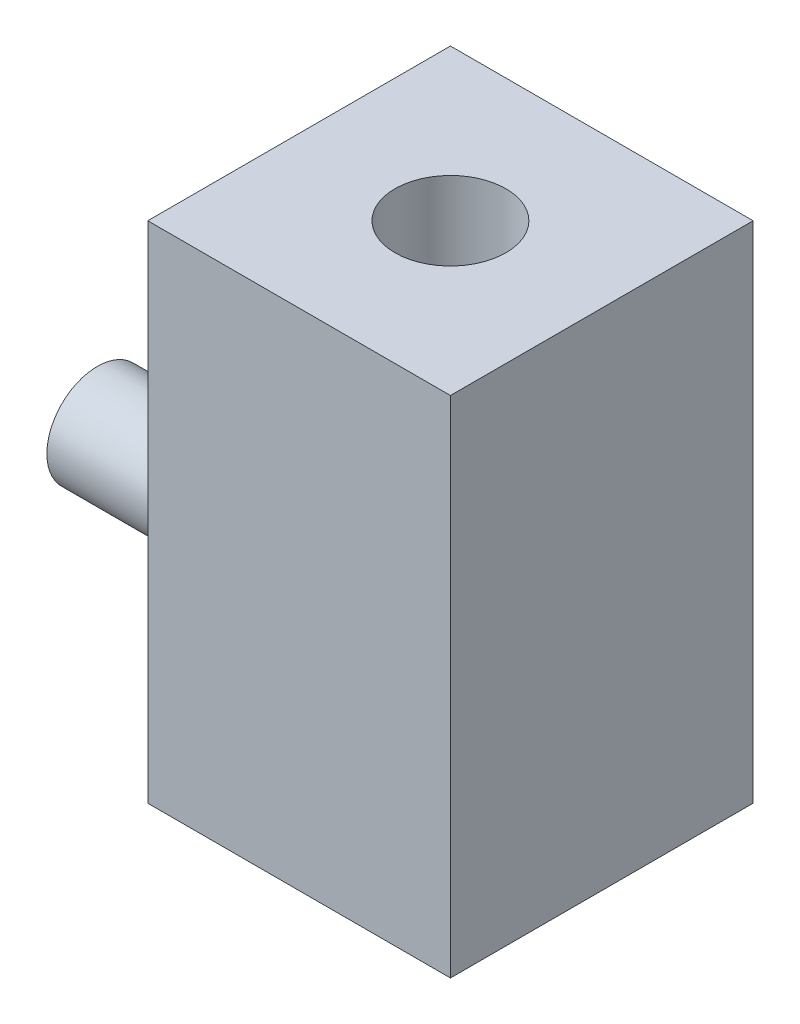
ISO-10303-21;
HEADER;
FILE_DESCRIPTION(('STEP AP214'),'2;1');
FILE_NAME('part.step','',(''),(''),'','','');
FILE_SCHEMA(('AUTOMOTIVE_DESIGN { 1 0 10303 214 1 1 1 1 }'));
ENDSEC;
DATA;
#1=APPLICATION_CONTEXT('core data for automotive mechanical design processes');
#2=APPLICATION_PROTOCOL_DEFINITION('international standard','automotive_design',2000,#1);
#3=PRODUCT_CONTEXT('',#1,'mechanical');
#4=PRODUCT('Part','Part','',(#3));
#5=PRODUCT_RELATED_PRODUCT_CATEGORY('part','',(#4));
#6=PRODUCT_DEFINITION_FORMATION('','',#4);
#7=PRODUCT_DEFINITION_CONTEXT('part definition',#1,'design');
#8=PRODUCT_DEFINITION('design','',#6,#7);
#9=PRODUCT_DEFINITION_SHAPE('','',#8);
#10=(LENGTH_UNIT() NAMED_UNIT(*) SI_UNIT(.MILLI.,.METRE.));
#11=(NAMED_UNIT(*) PLANE_ANGLE_UNIT() SI_UNIT($,.RADIAN.));
#12=(NAMED_UNIT(*) SI_UNIT($,.STERADIAN.) SOLID_ANGLE_UNIT());
#13=UNCERTAINTY_MEASURE_WITH_UNIT(LENGTH_MEASURE(1.E-05),#10,'distance_accuracy_value','');
#14=(GEOMETRIC_REPRESENTATION_CONTEXT(3) GLOBAL_UNCERTAINTY_ASSIGNED_CONTEXT((#13)) GLOBAL_UNIT_ASSIGNED_CONTEXT((#10,
#11,#12)) REPRESENTATION_CONTEXT('',''));
#15=CARTESIAN_POINT('',(0.,0.,0.));
#16=DIRECTION('',(0.,0.,1.));
#17=DIRECTION('',(1.,0.,0.));
#18=AXIS2_PLACEMENT_3D('',#15,#16,#17);
#19=CARTESIAN_POINT('',(38.1,63.5,76.2));
#20=DIRECTION('',(-1.,0.,0.));
#21=DIRECTION('',(0.,-1.,0.));
#22=AXIS2_PLACEMENT_3D('',#19,#20,#21);
#23=PLANE('',#22);
#24=DIRECTION('',(0.,1.,0.));
#25=VECTOR('',#24,1.);
#26=CARTESIAN_POINT('',(38.1,63.5,0.));
#27=LINE('',#26,#25);
#28=CARTESIAN_POINT('',(38.1,-63.5,0.));
#29=VERTEX_POINT('',#28);
#30=CARTESIAN_POINT('',(38.1,63.5,0.));
#31=VERTEX_POINT('',#30);
#32=EDGE_CURVE('E104',#29,#31,#27,.T.);
#33=ORIENTED_EDGE('',*,*,#32,.T.);
#34=DIRECTION('',(0.,0.,-1.));
#35=VECTOR('',#34,1.);
#36=CARTESIAN_POINT('',(38.1,63.5,76.2));
#37=LINE('',#36,#35);
#38=CARTESIAN_POINT('',(38.1,63.5,76.2));
#39=VERTEX_POINT('',#38);
#40=EDGE_CURVE('E45',#39,#31,#37,.T.);
#41=ORIENTED_EDGE('',*,*,#40,.F.);
#42=DIRECTION('',(0.,1.,0.));
#43=VECTOR('',#42,1.);
#44=CARTESIAN_POINT('',(38.1,63.5,76.2));
#45=LINE('',#44,#43);
#46=CARTESIAN_POINT('',(38.1,-63.5,76.2));
#47=VERTEX_POINT('',#46);
#48=EDGE_CURVE('E95',#47,#39,#45,.T.);
#49=ORIENTED_EDGE('',*,*,#48,.F.);
#50=DIRECTION('',(0.,0.,-1.));
#51=VECTOR('',#50,1.);
#52=CARTESIAN_POINT('',(38.1,-63.5,76.2));
#53=LINE('',#52,#51);
#54=EDGE_CURVE('E101',#47,#29,#53,.T.);
#55=ORIENTED_EDGE('',*,*,#54,.T.);
#56=EDGE_LOOP('',(#33,#41,#49,#55));
#57=FACE_BOUND('',#56,.T.);
#58=ADVANCED_FACE('F39',(#57),#23,.F.);
#59=CARTESIAN_POINT('',(-38.1,63.5,76.2));
#60=DIRECTION('',(0.,-1.,0.));
#61=DIRECTION('',(0.,0.,-1.));
#62=AXIS2_PLACEMENT_3D('',#59,#60,#61);
#63=PLANE('',#62);
#64=CARTESIAN_POINT('',(0.,63.5,38.1));
#65=DIRECTION('',(0.,1.,0.));
#66=DIRECTION('',(0.,0.,1.));
#67=AXIS2_PLACEMENT_3D('',#64,#65,#66);
#68=CIRCLE('',#67,13.97);
#69=CARTESIAN_POINT('',(0.,63.5,52.07));
#70=VERTEX_POINT('',#69);
#71=EDGE_CURVE('E118',#70,#70,#68,.T.);
#72=ORIENTED_EDGE('',*,*,#71,.F.);
#73=EDGE_LOOP('',(#72));
#74=FACE_BOUND('',#73,.T.);
#75=DIRECTION('',(-1.,0.,0.));
#76=VECTOR('',#75,1.);
#77=CARTESIAN_POINT('',(-38.1,63.5,0.));
#78=LINE('',#77,#76);
#79=CARTESIAN_POINT('',(-38.1,63.5,0.));
#80=VERTEX_POINT('',#79);
#81=EDGE_CURVE('E100',#31,#80,#78,.T.);
#82=ORIENTED_EDGE('',*,*,#81,.T.);
#83=DIRECTION('',(0.,0.,-1.));
#84=VECTOR('',#83,1.);
#85=CARTESIAN_POINT('',(-38.1,63.5,76.2));
#86=LINE('',#85,#84);
#87=CARTESIAN_POINT('',(-38.1,63.5,76.2));
#88=VERTEX_POINT('',#87);
#89=EDGE_CURVE('E92',#88,#80,#86,.T.);
#90=ORIENTED_EDGE('',*,*,#89,.F.);
#91=DIRECTION('',(-1.,0.,0.));
#92=VECTOR('',#91,1.);
#93=CARTESIAN_POINT('',(-38.1,63.5,76.2));
#94=LINE('',#93,#92);
#95=EDGE_CURVE('E87',#39,#88,#94,.T.);
#96=ORIENTED_EDGE('',*,*,#95,.F.);
#97=ORIENTED_EDGE('',*,*,#40,.T.);
#98=EDGE_LOOP('',(#82,#90,#96,#97));
#99=FACE_BOUND('',#98,.T.);
#100=ADVANCED_FACE('F96',(#74,#99),#63,.F.);
#101=CARTESIAN_POINT('',(-38.1,63.5,76.2));
#102=DIRECTION('',(1.,0.,0.));
#103=DIRECTION('',(0.,1.,0.));
#104=AXIS2_PLACEMENT_3D('',#101,#102,#103);
#105=PLANE('',#104);
#106=CARTESIAN_POINT('',(-38.1,-25.4,38.1));
#107=DIRECTION('',(-1.,0.,0.));
#108=DIRECTION('',(0.,-1.,0.));
#109=AXIS2_PLACEMENT_3D('',#106,#107,#108);
#110=CIRCLE('',#109,12.7);
#111=CARTESIAN_POINT('',(-38.1,-38.1,38.1));
#112=VERTEX_POINT('',#111);
#113=EDGE_CURVE('E11',#112,#112,#110,.T.);
#114=ORIENTED_EDGE('',*,*,#113,.F.);
#115=EDGE_LOOP('',(#114));
#116=FACE_BOUND('',#115,.T.);
#117=DIRECTION('',(0.,-1.,0.));
#118=VECTOR('',#117,1.);
#119=CARTESIAN_POINT('',(-38.1,63.5,0.));
#120=LINE('',#119,#118);
#121=CARTESIAN_POINT('',(-38.1,-63.5,0.));
#122=VERTEX_POINT('',#121);
#123=EDGE_CURVE('E71',#80,#122,#120,.T.);
#124=ORIENTED_EDGE('',*,*,#123,.T.);
#125=DIRECTION('',(0.,0.,-1.));
#126=VECTOR('',#125,1.);
#127=CARTESIAN_POINT('',(-38.1,-63.5,76.2));
#128=LINE('',#127,#126);
#129=CARTESIAN_POINT('',(-38.1,-63.5,76.2));
#130=VERTEX_POINT('',#129);
#131=EDGE_CURVE('E98',#130,#122,#128,.T.);
#132=ORIENTED_EDGE('',*,*,#131,.F.);
#133=DIRECTION('',(0.,-1.,0.));
#134=VECTOR('',#133,1.);
#135=CARTESIAN_POINT('',(-38.1,63.5,76.2));
#136=LINE('',#135,#134);
#137=EDGE_CURVE('E89',#88,#130,#136,.T.);
#138=ORIENTED_EDGE('',*,*,#137,.F.);
#139=ORIENTED_EDGE('',*,*,#89,.T.);
#140=EDGE_LOOP('',(#124,#132,#138,#139));
#141=FACE_BOUND('',#140,.T.);
#142=ADVANCED_FACE('F97',(#116,#141),#105,.F.);
#143=CARTESIAN_POINT('',(-38.1,-63.5,76.2));
#144=DIRECTION('',(0.,1.,0.));
#145=DIRECTION('',(0.,0.,1.));
#146=AXIS2_PLACEMENT_3D('',#143,#144,#145);
#147=PLANE('',#146);
#148=DIRECTION('',(1.,0.,0.));
#149=VECTOR('',#148,1.);
#150=CARTESIAN_POINT('',(-38.1,-63.5,0.));
#151=LINE('',#150,#149);
#152=EDGE_CURVE('E78',#122,#29,#151,.T.);
#153=ORIENTED_EDGE('',*,*,#152,.T.);
#154=ORIENTED_EDGE('',*,*,#54,.F.);
#155=DIRECTION('',(1.,0.,0.));
#156=VECTOR('',#155,1.);
#157=CARTESIAN_POINT('',(-38.1,-63.5,76.2));
#158=LINE('',#157,#156);
#159=EDGE_CURVE('E57',#130,#47,#158,.T.);
#160=ORIENTED_EDGE('',*,*,#159,.F.);
#161=ORIENTED_EDGE('',*,*,#131,.T.);
#162=EDGE_LOOP('',(#153,#154,#160,#161));
#163=FACE_BOUND('',#162,.T.);
#164=ADVANCED_FACE('F114',(#163),#147,.F.);
#165=CARTESIAN_POINT('',(0.,0.,76.2));
#166=DIRECTION('',(0.,0.,1.));
#167=DIRECTION('',(1.,0.,0.));
#168=AXIS2_PLACEMENT_3D('',#165,#166,#167);
#169=PLANE('',#168);
#170=ORIENTED_EDGE('',*,*,#48,.T.);
#171=ORIENTED_EDGE('',*,*,#95,.T.);
#172=ORIENTED_EDGE('',*,*,#137,.T.);
#173=ORIENTED_EDGE('',*,*,#159,.T.);
#174=EDGE_LOOP('',(#170,#171,#172,#173));
#175=FACE_BOUND('',#174,.T.);
#176=ADVANCED_FACE('F86',(#175),#169,.T.);
#177=CARTESIAN_POINT('',(0.,0.,0.));
#178=DIRECTION('',(0.,0.,1.));
#179=DIRECTION('',(1.,0.,0.));
#180=AXIS2_PLACEMENT_3D('',#177,#178,#179);
#181=PLANE('',#180);
#182=ORIENTED_EDGE('',*,*,#32,.F.);
#183=ORIENTED_EDGE('',*,*,#152,.F.);
#184=ORIENTED_EDGE('',*,*,#123,.F.);
#185=ORIENTED_EDGE('',*,*,#81,.F.);
#186=EDGE_LOOP('',(#182,#183,#184,#185));
#187=FACE_BOUND('',#186,.T.);
#188=ADVANCED_FACE('F119',(#187),#181,.F.);
#189=CARTESIAN_POINT('',(0.,15.24,38.1));
#190=DIRECTION('',(0.,1.,0.));
#191=DIRECTION('',(0.,0.,1.));
#192=AXIS2_PLACEMENT_3D('',#189,#190,#191);
#193=CYLINDRICAL_SURFACE('',#192,13.97);
#194=CARTESIAN_POINT('',(0.,15.24,38.1));
#195=DIRECTION('',(0.,1.,0.));
#196=DIRECTION('',(0.,0.,1.));
#197=AXIS2_PLACEMENT_3D('',#194,#195,#196);
#198=CIRCLE('',#197,13.97);
#199=CARTESIAN_POINT('',(0.,15.24,52.07));
#200=VERTEX_POINT('',#199);
#201=EDGE_CURVE('E107',#200,#200,#198,.T.);
#202=CARTESIAN_POINT('',(0.,15.24,52.07));
#203=CARTESIAN_POINT('',(0.,15.7427083333333,52.07));
#204=CARTESIAN_POINT('',(0.,16.2454166666667,52.07));
#205=CARTESIAN_POINT('',(0.,17.2508333333333,52.07));
#206=CARTESIAN_POINT('',(0.,17.7535416666667,52.07));
#207=CARTESIAN_POINT('',(0.,18.7589583333333,52.07));
#208=CARTESIAN_POINT('',(0.,19.2616666666667,52.07));
#209=CARTESIAN_POINT('',(0.,20.2670833333333,52.07));
#210=CARTESIAN_POINT('',(0.,20.7697916666667,52.07));
#211=CARTESIAN_POINT('',(0.,21.7752083333333,52.07));
#212=CARTESIAN_POINT('',(0.,22.2779166666667,52.07));
#213=CARTESIAN_POINT('',(0.,23.2833333333333,52.07));
#214=CARTESIAN_POINT('',(0.,23.7860416666667,52.07));
#215=CARTESIAN_POINT('',(0.,24.7914583333333,52.07));
#216=CARTESIAN_POINT('',(0.,25.2941666666667,52.07));
#217=CARTESIAN_POINT('',(0.,26.2995833333333,52.07));
#218=CARTESIAN_POINT('',(0.,26.8022916666667,52.07));
#219=CARTESIAN_POINT('',(0.,27.8077083333333,52.07));
#220=CARTESIAN_POINT('',(0.,28.3104166666667,52.07));
#221=CARTESIAN_POINT('',(0.,29.3158333333333,52.07));
#222=CARTESIAN_POINT('',(0.,29.8185416666667,52.07));
#223=CARTESIAN_POINT('',(0.,30.8239583333333,52.07));
#224=CARTESIAN_POINT('',(0.,31.3266666666667,52.07));
#225=CARTESIAN_POINT('',(0.,32.3320833333333,52.07));
#226=CARTESIAN_POINT('',(0.,32.8347916666667,52.07));
#227=CARTESIAN_POINT('',(0.,33.8402083333333,52.07));
#228=CARTESIAN_POINT('',(0.,34.3429166666667,52.07));
#229=CARTESIAN_POINT('',(0.,35.3483333333333,52.07));
#230=CARTESIAN_POINT('',(0.,35.8510416666667,52.07));
#231=CARTESIAN_POINT('',(0.,36.8564583333333,52.07));
#232=CARTESIAN_POINT('',(0.,37.3591666666667,52.07));
#233=CARTESIAN_POINT('',(0.,38.3645833333333,52.07));
#234=CARTESIAN_POINT('',(0.,38.8672916666667,52.07));
#235=CARTESIAN_POINT('',(0.,39.8727083333333,52.07));
#236=CARTESIAN_POINT('',(0.,40.3754166666667,52.07));
#237=CARTESIAN_POINT('',(0.,41.3808333333333,52.07));
#238=CARTESIAN_POINT('',(0.,41.8835416666667,52.07));
#239=CARTESIAN_POINT('',(0.,42.8889583333333,52.07));
#240=CARTESIAN_POINT('',(0.,43.3916666666667,52.07));
#241=CARTESIAN_POINT('',(0.,44.3970833333333,52.07));
#242=CARTESIAN_POINT('',(0.,44.8997916666667,52.07));
#243=CARTESIAN_POINT('',(0.,45.9052083333333,52.07));
#244=CARTESIAN_POINT('',(0.,46.4079166666667,52.07));
#245=CARTESIAN_POINT('',(0.,47.4133333333333,52.07));
#246=CARTESIAN_POINT('',(0.,47.9160416666667,52.07));
#247=CARTESIAN_POINT('',(0.,48.9214583333333,52.07));
#248=CARTESIAN_POINT('',(0.,49.4241666666667,52.07));
#249=CARTESIAN_POINT('',(0.,50.4295833333333,52.07));
#250=CARTESIAN_POINT('',(0.,50.9322916666667,52.07));
#251=CARTESIAN_POINT('',(0.,51.9377083333333,52.07));
#252=CARTESIAN_POINT('',(0.,52.4404166666667,52.07));
#253=CARTESIAN_POINT('',(0.,53.4458333333333,52.07));
#254=CARTESIAN_POINT('',(0.,53.9485416666667,52.07));
#255=CARTESIAN_POINT('',(0.,54.9539583333333,52.07));
#256=CARTESIAN_POINT('',(0.,55.4566666666667,52.07));
#257=CARTESIAN_POINT('',(0.,56.4620833333333,52.07));
#258=CARTESIAN_POINT('',(0.,56.9647916666667,52.07));
#259=CARTESIAN_POINT('',(0.,57.9702083333333,52.07));
#260=CARTESIAN_POINT('',(0.,58.4729166666667,52.07));
#261=CARTESIAN_POINT('',(0.,59.4783333333333,52.07));
#262=CARTESIAN_POINT('',(0.,59.9810416666667,52.07));
#263=CARTESIAN_POINT('',(0.,60.9864583333333,52.07));
#264=CARTESIAN_POINT('',(0.,61.4891666666667,52.07));
#265=CARTESIAN_POINT('',(0.,62.4945833333333,52.07));
#266=CARTESIAN_POINT('',(0.,62.9972916666667,52.07));
#267=CARTESIAN_POINT('',(0.,63.5,52.07));
#268=B_SPLINE_CURVE_WITH_KNOTS('',3,(#202,#203,#204,#205,#206,#207,#208,#209,#210,#211,#212,
#213,#214,#215,#216,#217,#218,#219,#220,#221,#222,#223,#224,#225,#226,#227,#228,#229,#230,#231,
#232,#233,#234,#235,#236,#237,#238,#239,#240,#241,#242,#243,#244,#245,#246,#247,#248,#249,#250,
#251,#252,#253,#254,#255,#256,#257,#258,#259,#260,#261,#262,#263,#264,#265,#266,#267),
.UNSPECIFIED.,.F.,.F.,(4,2,2,2,2,2,2,2,2,2,2,2,2,2,2,2,2,2,2,2,2,2,2,2,2,2,2,2,2,2,2,2,4),(0.,
1.508125,3.01625,4.524375,6.0325,7.540625,9.04875,10.556875,12.065,13.573125,15.08125,16.589375,
18.0975,19.605625,21.11375,22.621875,24.13,25.638125,27.14625,28.654375,30.1625,31.670625,
33.17875,34.686875,36.195,37.703125,39.21125,40.719375,42.2275,43.735625,45.24375,46.751875,
48.26),.UNSPECIFIED.);
#269=EDGE_CURVE('BSEAM169',#200,#70,#268,.T.);
#270=ORIENTED_EDGE('',*,*,#201,.F.);
#271=ORIENTED_EDGE('',*,*,#71,.T.);
#272=ORIENTED_EDGE('',*,*,#269,.T.);
#273=ORIENTED_EDGE('',*,*,#269,.F.);
#274=EDGE_LOOP('',(#270,#272,#271,#273));
#275=FACE_BOUND('',#274,.T.);
#276=ADVANCED_FACE('F169',(#275),#193,.F.);
#277=CARTESIAN_POINT('',(0.,15.24,38.1));
#278=DIRECTION('',(0.,1.,0.));
#279=DIRECTION('',(0.,0.,1.));
#280=AXIS2_PLACEMENT_3D('',#277,#278,#279);
#281=PLANE('',#280);
#282=ORIENTED_EDGE('',*,*,#201,.T.);
#283=EDGE_LOOP('',(#282));
#284=FACE_BOUND('',#283,.T.);
#285=ADVANCED_FACE('F135',(#284),#281,.T.);
#286=CARTESIAN_POINT('',(-88.9,-25.4,38.1));
#287=DIRECTION('',(1.,0.,0.));
#288=DIRECTION('',(0.,1.,0.));
#289=AXIS2_PLACEMENT_3D('',#286,#287,#288);
#290=CYLINDRICAL_SURFACE('',#289,12.7);
#291=CARTESIAN_POINT('',(-88.9,-25.4,38.1));
#292=DIRECTION('',(-1.,0.,0.));
#293=DIRECTION('',(0.,-1.,0.));
#294=AXIS2_PLACEMENT_3D('',#291,#292,#293);
#295=CIRCLE('',#294,12.7);
#296=CARTESIAN_POINT('',(-88.9,-38.1,38.1));
#297=VERTEX_POINT('',#296);
#298=EDGE_CURVE('E124',#297,#297,#295,.T.);
#299=ORIENTED_EDGE('',*,*,#298,.F.);
#300=EDGE_LOOP('',(#299));
#301=FACE_BOUND('',#300,.T.);
#302=ORIENTED_EDGE('',*,*,#113,.T.);
#303=EDGE_LOOP('',(#302));
#304=FACE_BOUND('',#303,.T.);
#305=ADVANCED_FACE('F128',(#301,#304),#290,.T.);
#306=CARTESIAN_POINT('',(-88.9,-25.4,38.1));
#307=DIRECTION('',(-1.,0.,0.));
#308=DIRECTION('',(0.,-1.,0.));
#309=AXIS2_PLACEMENT_3D('',#306,#307,#308);
#310=PLANE('',#309);
#311=ORIENTED_EDGE('',*,*,#298,.T.);
#312=EDGE_LOOP('',(#311));
#313=FACE_BOUND('',#312,.T.);
#314=ADVANCED_FACE('F126',(#313),#310,.T.);
#315=CLOSED_SHELL('',(#58,#100,#142,#164,#176,#188,#276,#285,#305,#314));
#316=MANIFOLD_SOLID_BREP('B2',#315);
#317=ADVANCED_BREP_SHAPE_REPRESENTATION('',(#18,#316),#14);
#318=SHAPE_DEFINITION_REPRESENTATION(#9,#317);
ENDSEC;
END-ISO-10303-21;
